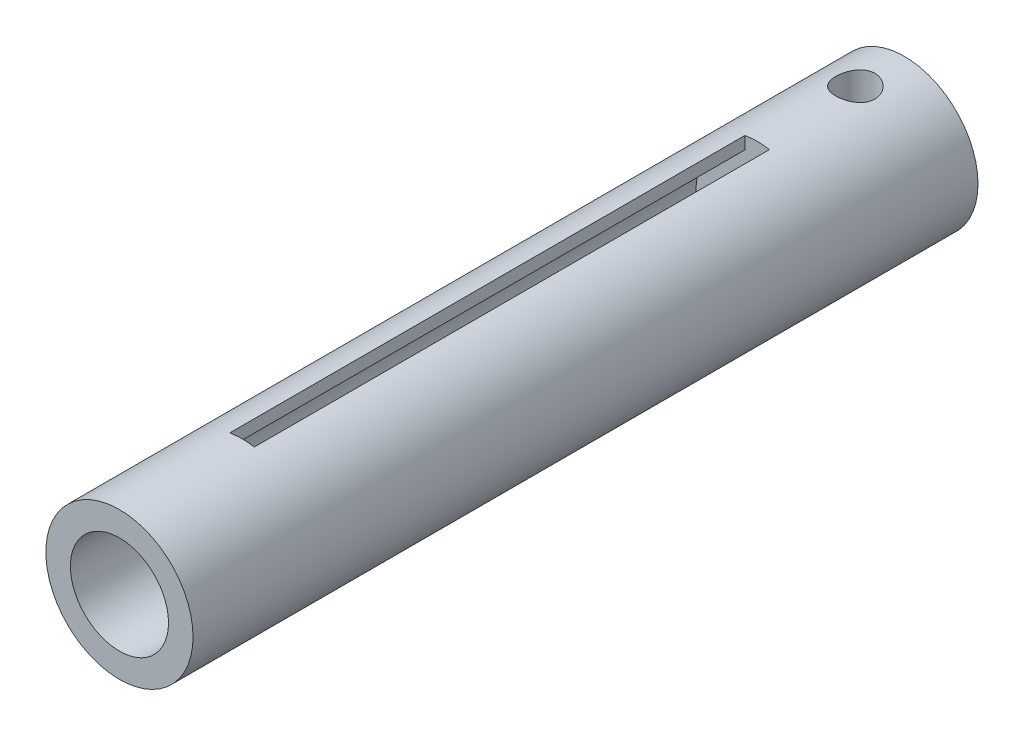
ISO-10303-21;
HEADER;
FILE_DESCRIPTION(('STEP AP214'),'2;1');
FILE_NAME('part.step','',(''),(''),'','','');
FILE_SCHEMA(('AUTOMOTIVE_DESIGN { 1 0 10303 214 1 1 1 1 }'));
ENDSEC;
DATA;
#1=APPLICATION_CONTEXT('core data for automotive mechanical design processes');
#2=APPLICATION_PROTOCOL_DEFINITION('international standard','automotive_design',2000,#1);
#3=PRODUCT_CONTEXT('',#1,'mechanical');
#4=PRODUCT('Part','Part','',(#3));
#5=PRODUCT_RELATED_PRODUCT_CATEGORY('part','',(#4));
#6=PRODUCT_DEFINITION_FORMATION('','',#4);
#7=PRODUCT_DEFINITION_CONTEXT('part definition',#1,'design');
#8=PRODUCT_DEFINITION('design','',#6,#7);
#9=PRODUCT_DEFINITION_SHAPE('','',#8);
#10=(LENGTH_UNIT() NAMED_UNIT(*) SI_UNIT(.MILLI.,.METRE.));
#11=(NAMED_UNIT(*) PLANE_ANGLE_UNIT() SI_UNIT($,.RADIAN.));
#12=(NAMED_UNIT(*) SI_UNIT($,.STERADIAN.) SOLID_ANGLE_UNIT());
#13=UNCERTAINTY_MEASURE_WITH_UNIT(LENGTH_MEASURE(1.E-05),#10,'distance_accuracy_value','');
#14=(GEOMETRIC_REPRESENTATION_CONTEXT(3) GLOBAL_UNCERTAINTY_ASSIGNED_CONTEXT((#13)) GLOBAL_UNIT_ASSIGNED_CONTEXT((#10,
#11,#12)) REPRESENTATION_CONTEXT('',''));
#15=CARTESIAN_POINT('',(0.,0.,0.));
#16=DIRECTION('',(0.,0.,1.));
#17=DIRECTION('',(1.,0.,0.));
#18=AXIS2_PLACEMENT_3D('',#15,#16,#17);
#19=CARTESIAN_POINT('',(0.,0.,20.));
#20=DIRECTION('',(0.,0.,1.));
#21=DIRECTION('',(1.,0.,0.));
#22=AXIS2_PLACEMENT_3D('',#19,#20,#21);
#23=CYLINDRICAL_SURFACE('',#22,12.5);
#24=DIRECTION('',(0.,0.,1.));
#25=VECTOR('',#24,1.);
#26=CARTESIAN_POINT('',(-2.5,12.2474487139159,20.));
#27=LINE('',#26,#25);
#28=CARTESIAN_POINT('',(-2.5,12.2474487139159,125.));
#29=VERTEX_POINT('',#28);
#30=CARTESIAN_POINT('',(-2.5,12.2474487139159,20.));
#31=VERTEX_POINT('',#30);
#32=EDGE_CURVE('E84',#29,#31,#27,.F.);
#33=ORIENTED_EDGE('',*,*,#32,.F.);
#34=CARTESIAN_POINT('',(0.,0.,125.));
#35=DIRECTION('',(0.,0.,1.));
#36=DIRECTION('',(1.,0.,0.));
#37=AXIS2_PLACEMENT_3D('',#34,#35,#36);
#38=CIRCLE('',#37,12.5);
#39=CARTESIAN_POINT('',(2.50000000000002,12.2474487139159,125.));
#40=VERTEX_POINT('',#39);
#41=EDGE_CURVE('E139',#29,#40,#38,.T.);
#42=ORIENTED_EDGE('',*,*,#41,.T.);
#43=DIRECTION('',(0.,0.,1.));
#44=VECTOR('',#43,1.);
#45=CARTESIAN_POINT('',(2.5,12.2474487139159,20.));
#46=LINE('',#45,#44);
#47=CARTESIAN_POINT('',(2.5,12.2474487139159,20.));
#48=VERTEX_POINT('',#47);
#49=EDGE_CURVE('E150',#40,#48,#46,.F.);
#50=ORIENTED_EDGE('',*,*,#49,.T.);
#51=CARTESIAN_POINT('',(0.,0.,20.));
#52=DIRECTION('',(0.,0.,1.));
#53=DIRECTION('',(1.,0.,0.));
#54=AXIS2_PLACEMENT_3D('',#51,#52,#53);
#55=CIRCLE('',#54,12.5);
#56=EDGE_CURVE('E136',#31,#48,#55,.T.);
#57=ORIENTED_EDGE('',*,*,#56,.F.);
#58=EDGE_LOOP('',(#33,#42,#50,#57));
#59=FACE_BOUND('',#58,.T.);
#60=ADVANCED_FACE('F33',(#59),#23,.F.);
#61=CARTESIAN_POINT('',(0.,0.,-10.));
#62=DIRECTION('',(0.,0.,1.));
#63=DIRECTION('',(1.,0.,0.));
#64=AXIS2_PLACEMENT_3D('',#61,#62,#63);
#65=CYLINDRICAL_SURFACE('',#64,15.);
#66=CARTESIAN_POINT('',(0.,-15.,4.));
#67=CARTESIAN_POINT('',(-0.220509111665708,-14.9999966762032,3.9999947661303));
#68=CARTESIAN_POINT('',(-0.441074320443681,-14.995089723243,3.98170477162066));
#69=CARTESIAN_POINT('',(-0.875850902708927,-14.9759914724332,3.90915753852261));
#70=CARTESIAN_POINT('',(-1.09005916663817,-14.9617957066517,3.85488299114777));
#71=CARTESIAN_POINT('',(-1.50578317809062,-14.9256866650558,3.71225666627193));
#72=CARTESIAN_POINT('',(-1.70731490203057,-14.9037833426075,3.62394882466796));
#73=CARTESIAN_POINT('',(-2.09270737278532,-14.8545739830336,3.41592551466677));
#74=CARTESIAN_POINT('',(-2.27656694089925,-14.8272675859036,3.29620795328142));
#75=CARTESIAN_POINT('',(-2.62565900748003,-14.7694922980399,3.02583296717326));
#76=CARTESIAN_POINT('',(-2.79042337972557,-14.7389693535736,2.87458266398347));
#77=CARTESIAN_POINT('',(-3.09257427321275,-14.6785481935918,2.54670303387329));
#78=CARTESIAN_POINT('',(-3.22995726991329,-14.6486500589449,2.37007044476495));
#79=CARTESIAN_POINT('',(-3.4757281848683,-14.5923107492874,1.9927035303491));
#80=CARTESIAN_POINT('',(-3.58357755472975,-14.5659377712648,1.79160734347655));
#81=CARTESIAN_POINT('',(-3.76375096153988,-14.5204295463637,1.37331977781515));
#82=CARTESIAN_POINT('',(-3.83608154902738,-14.5012929650653,1.15613137533712));
#83=CARTESIAN_POINT('',(-3.94153840453008,-14.472982316048,0.717008924349973));
#84=CARTESIAN_POINT('',(-3.97551340489383,-14.4635929562298,0.495292920138529));
#85=CARTESIAN_POINT('',(-4.00594069411639,-14.4551966183274,0.0491246333869234));
#86=CARTESIAN_POINT('',(-4.00239999411507,-14.4561877002889,-0.175327130048134));
#87=CARTESIAN_POINT('',(-3.95857020005398,-14.4682475760406,-0.613970830748121));
#88=CARTESIAN_POINT('',(-3.91930812129529,-14.4790347102306,-0.828274364076972));
#89=CARTESIAN_POINT('',(-3.80679497444366,-14.5090202616138,-1.24713666891248));
#90=CARTESIAN_POINT('',(-3.7335411898599,-14.5282193510522,-1.45169466015069));
#91=CARTESIAN_POINT('',(-3.55428713930512,-14.5731132349677,-1.84793628761715));
#92=CARTESIAN_POINT('',(-3.44792682275569,-14.5988788563741,-2.03944867857251));
#93=CARTESIAN_POINT('',(-3.20573007647555,-14.6539645928489,-2.40226831770305));
#94=CARTESIAN_POINT('',(-3.06988784448503,-14.6832854071037,-2.57357157831294));
#95=CARTESIAN_POINT('',(-2.76733214526838,-14.7433502125973,-2.8969779949096));
#96=CARTESIAN_POINT('',(-2.59975625456598,-14.7741094297766,-3.0482726366299));
#97=CARTESIAN_POINT('',(-2.24123533641274,-14.8327276255263,-3.32077756070057));
#98=CARTESIAN_POINT('',(-2.05028938841018,-14.8605864897711,-3.44198665740485));
#99=CARTESIAN_POINT('',(-1.6491965109949,-14.9104364079659,-3.6512358056493));
#100=CARTESIAN_POINT('',(-1.43896980510358,-14.9324014566712,-3.73912954089718));
#101=CARTESIAN_POINT('',(-1.00600458878079,-14.96780088802,-3.87809437762674));
#102=CARTESIAN_POINT('',(-0.783268823856646,-14.981237134675,-3.92917352544791));
#103=CARTESIAN_POINT('',(-0.338508166291031,-14.9977831711677,-3.99178975383565));
#104=CARTESIAN_POINT('',(-0.116648475282761,-15.0011799494192,-4.00442607970173));
#105=CARTESIAN_POINT('',(0.326020091802397,-14.9980894338339,-3.99283367150611));
#106=CARTESIAN_POINT('',(0.546829074124227,-14.9916031616071,-3.96860874778846));
#107=CARTESIAN_POINT('',(0.977204899803558,-14.9696607099204,-3.88488310508005));
#108=CARTESIAN_POINT('',(1.18689970405556,-14.9543605309265,-3.82599550760447));
#109=CARTESIAN_POINT('',(1.59341394235213,-14.9165258978828,-3.6753281109841));
#110=CARTESIAN_POINT('',(1.79023197843205,-14.8939906599234,-3.58354474749891));
#111=CARTESIAN_POINT('',(2.1696769493359,-14.8435132111904,-3.36765222563892));
#112=CARTESIAN_POINT('',(2.35195037692236,-14.8154737320985,-3.2429450664045));
#113=CARTESIAN_POINT('',(2.69336927079429,-14.7572290473119,-2.96549673968402));
#114=CARTESIAN_POINT('',(2.85251015759837,-14.7270234145527,-2.81275003479793));
#115=CARTESIAN_POINT('',(3.14777848957546,-14.6667949173317,-2.47842884501084));
#116=CARTESIAN_POINT('',(3.28313038499627,-14.6368012285772,-2.29616287720948));
#117=CARTESIAN_POINT('',(3.52134382370242,-14.5813289436636,-1.91087060780093));
#118=CARTESIAN_POINT('',(3.62420672244342,-14.5558501591602,-1.70784517275605));
#119=CARTESIAN_POINT('',(3.79374823172204,-14.5125853674305,-1.28780938584714));
#120=CARTESIAN_POINT('',(3.8606362450784,-14.4947549662348,-1.07088837636242));
#121=CARTESIAN_POINT('',(3.95682410237657,-14.4687965026614,-0.62832136065292));
#122=CARTESIAN_POINT('',(3.98613355205236,-14.4606659608681,-0.402677599313207));
#123=CARTESIAN_POINT('',(4.00577979307212,-14.4552348910192,0.0429895757885995));
#124=CARTESIAN_POINT('',(3.99736311235129,-14.4575879532022,0.262954640573328));
#125=CARTESIAN_POINT('',(3.94468751999858,-14.4720479199639,0.698207028070503));
#126=CARTESIAN_POINT('',(3.9004295306998,-14.4841545735456,0.913494471009552));
#127=CARTESIAN_POINT('',(3.77805031399794,-14.5165514219021,1.33171150424024));
#128=CARTESIAN_POINT('',(3.70019322151266,-14.5367777005106,1.53472368545915));
#129=CARTESIAN_POINT('',(3.51303109124666,-14.5831363626058,1.9249576610735));
#130=CARTESIAN_POINT('',(3.40372112049204,-14.6092696723953,2.11217697260241));
#131=CARTESIAN_POINT('',(3.15297818537663,-14.6654584288421,2.47146071899177));
#132=CARTESIAN_POINT('',(3.01069459535826,-14.6956066620426,2.64291706995204));
#133=CARTESIAN_POINT('',(2.69966107022192,-14.7559100756513,2.95992490333505));
#134=CARTESIAN_POINT('',(2.53090470871747,-14.7860652559664,3.10547007733779));
#135=CARTESIAN_POINT('',(2.16735996217739,-14.8437562480818,3.36958447529361));
#136=CARTESIAN_POINT('',(1.97209192350356,-14.8712222262917,3.48751002129863));
#137=CARTESIAN_POINT('',(1.56377728083377,-14.9196762020573,3.68867483185876));
#138=CARTESIAN_POINT('',(1.35074218939259,-14.9406683536717,3.77193635132721));
#139=CARTESIAN_POINT('',(0.948749409761982,-14.9710950502695,3.89055057083103));
#140=CARTESIAN_POINT('',(0.761524033130072,-14.9818554118521,3.93149876718499));
#141=CARTESIAN_POINT('',(0.382879590634153,-14.9963089807291,3.98622441233412));
#142=CARTESIAN_POINT('',(0.191460940809721,-15.0000028859454,4.00000454440005));
#143=CARTESIAN_POINT('',(0.,-15.,4.));
#144=B_SPLINE_CURVE_WITH_KNOTS('',3,(#66,#67,#68,#69,#70,#71,#72,#73,#74,#75,#76,#77,#78,#79,
#80,#81,#82,#83,#84,#85,#86,#87,#88,#89,#90,#91,#92,#93,#94,#95,#96,#97,#98,#99,#100,#101,#102,
#103,#104,#105,#106,#107,#108,#109,#110,#111,#112,#113,#114,#115,#116,#117,#118,#119,#120,#121,
#122,#123,#124,#125,#126,#127,#128,#129,#130,#131,#132,#133,#134,#135,#136,#137,#138,#139,#140,
#141,#142,#143),.UNSPECIFIED.,.T.,.F.,(4,2,2,2,2,2,2,2,2,2,2,2,2,2,2,2,2,2,2,2,2,2,2,2,2,2,2,2,
2,2,2,2,2,2,2,2,2,2,4),(0.,0.660825197899138,1.3219684875229,1.98226110594386,2.6425977341735,
3.31669795909934,3.99088489850298,4.67665165046458,5.36229188259399,6.03244316500936,
6.70246920808639,7.35382004091993,8.00522293625879,8.66397346692995,9.32285376235259,
10.0032251962464,10.6836234387519,11.3669761920608,12.0501795438028,12.7136543504909,
13.377060578507,14.0290707128423,14.6811515155123,15.346005720091,16.0109913651777,
16.6947299276558,17.3784399604821,18.0581259539877,18.7376381732796,19.394866848109,
20.0520786104837,20.7042153090379,21.3564543425319,22.0278867914997,22.6994824867208,
23.3854450456898,24.0709665229755,24.6447963799386,25.2185695593995),.UNSPECIFIED.);
#145=CARTESIAN_POINT('',(0.,-15.,4.));
#146=VERTEX_POINT('',#145);
#147=EDGE_CURVE('E81',#146,#146,#144,.T.);
#148=ORIENTED_EDGE('',*,*,#147,.F.);
#149=EDGE_LOOP('',(#148));
#150=FACE_BOUND('',#149,.T.);
#151=CARTESIAN_POINT('',(0.,15.,4.));
#152=CARTESIAN_POINT('',(0.220509111665708,14.9999966762032,3.9999947661303));
#153=CARTESIAN_POINT('',(0.441074320443681,14.995089723243,3.98170477162066));
#154=CARTESIAN_POINT('',(0.875850902708927,14.9759914724332,3.90915753852261));
#155=CARTESIAN_POINT('',(1.09005916663817,14.9617957066517,3.85488299114777));
#156=CARTESIAN_POINT('',(1.50578317809062,14.9256866650558,3.71225666627193));
#157=CARTESIAN_POINT('',(1.70731490203057,14.9037833426075,3.62394882466796));
#158=CARTESIAN_POINT('',(2.09270737278532,14.8545739830336,3.41592551466677));
#159=CARTESIAN_POINT('',(2.27656694089925,14.8272675859036,3.29620795328142));
#160=CARTESIAN_POINT('',(2.62565900748003,14.7694922980399,3.02583296717326));
#161=CARTESIAN_POINT('',(2.79042337972557,14.7389693535736,2.87458266398347));
#162=CARTESIAN_POINT('',(3.09257427321275,14.6785481935918,2.54670303387329));
#163=CARTESIAN_POINT('',(3.22995726991329,14.6486500589449,2.37007044476495));
#164=CARTESIAN_POINT('',(3.4757281848683,14.5923107492874,1.9927035303491));
#165=CARTESIAN_POINT('',(3.58357755472975,14.5659377712648,1.79160734347655));
#166=CARTESIAN_POINT('',(3.76375096153988,14.5204295463637,1.37331977781515));
#167=CARTESIAN_POINT('',(3.83608154902738,14.5012929650653,1.15613137533712));
#168=CARTESIAN_POINT('',(3.94153840453008,14.472982316048,0.717008924349973));
#169=CARTESIAN_POINT('',(3.97551340489383,14.4635929562298,0.495292920138529));
#170=CARTESIAN_POINT('',(4.00594069411639,14.4551966183274,0.0491246333869234));
#171=CARTESIAN_POINT('',(4.00239999411507,14.4561877002889,-0.175327130048134));
#172=CARTESIAN_POINT('',(3.95857020005398,14.4682475760406,-0.613970830748121));
#173=CARTESIAN_POINT('',(3.91930812129529,14.4790347102306,-0.828274364076972));
#174=CARTESIAN_POINT('',(3.80679497444366,14.5090202616138,-1.24713666891248));
#175=CARTESIAN_POINT('',(3.7335411898599,14.5282193510522,-1.45169466015069));
#176=CARTESIAN_POINT('',(3.55428713930512,14.5731132349677,-1.84793628761715));
#177=CARTESIAN_POINT('',(3.44792682275569,14.5988788563741,-2.03944867857251));
#178=CARTESIAN_POINT('',(3.20573007647555,14.6539645928489,-2.40226831770305));
#179=CARTESIAN_POINT('',(3.06988784448503,14.6832854071037,-2.57357157831294));
#180=CARTESIAN_POINT('',(2.76733214526838,14.7433502125973,-2.8969779949096));
#181=CARTESIAN_POINT('',(2.59975625456598,14.7741094297766,-3.0482726366299));
#182=CARTESIAN_POINT('',(2.24123533641274,14.8327276255263,-3.32077756070057));
#183=CARTESIAN_POINT('',(2.05028938841018,14.8605864897711,-3.44198665740485));
#184=CARTESIAN_POINT('',(1.6491965109949,14.9104364079659,-3.6512358056493));
#185=CARTESIAN_POINT('',(1.43896980510358,14.9324014566712,-3.73912954089718));
#186=CARTESIAN_POINT('',(1.00600458878079,14.96780088802,-3.87809437762674));
#187=CARTESIAN_POINT('',(0.783268823856646,14.981237134675,-3.92917352544791));
#188=CARTESIAN_POINT('',(0.338508166291031,14.9977831711677,-3.99178975383565));
#189=CARTESIAN_POINT('',(0.116648475282761,15.0011799494192,-4.00442607970173));
#190=CARTESIAN_POINT('',(-0.326020091802397,14.9980894338339,-3.99283367150611));
#191=CARTESIAN_POINT('',(-0.546829074124227,14.9916031616071,-3.96860874778846));
#192=CARTESIAN_POINT('',(-0.977204899803558,14.9696607099204,-3.88488310508005));
#193=CARTESIAN_POINT('',(-1.18689970405556,14.9543605309265,-3.82599550760447));
#194=CARTESIAN_POINT('',(-1.59341394235213,14.9165258978828,-3.6753281109841));
#195=CARTESIAN_POINT('',(-1.79023197843205,14.8939906599234,-3.58354474749891));
#196=CARTESIAN_POINT('',(-2.1696769493359,14.8435132111904,-3.36765222563892));
#197=CARTESIAN_POINT('',(-2.35195037692236,14.8154737320985,-3.2429450664045));
#198=CARTESIAN_POINT('',(-2.69336927079429,14.7572290473119,-2.96549673968402));
#199=CARTESIAN_POINT('',(-2.85251015759837,14.7270234145527,-2.81275003479793));
#200=CARTESIAN_POINT('',(-3.14777848957546,14.6667949173317,-2.47842884501084));
#201=CARTESIAN_POINT('',(-3.28313038499627,14.6368012285772,-2.29616287720948));
#202=CARTESIAN_POINT('',(-3.52134382370242,14.5813289436636,-1.91087060780093));
#203=CARTESIAN_POINT('',(-3.62420672244342,14.5558501591602,-1.70784517275605));
#204=CARTESIAN_POINT('',(-3.79374823172204,14.5125853674305,-1.28780938584714));
#205=CARTESIAN_POINT('',(-3.8606362450784,14.4947549662348,-1.07088837636242));
#206=CARTESIAN_POINT('',(-3.95682410237657,14.4687965026614,-0.62832136065292));
#207=CARTESIAN_POINT('',(-3.98613355205236,14.4606659608681,-0.402677599313207));
#208=CARTESIAN_POINT('',(-4.00577979307212,14.4552348910192,0.0429895757885995));
#209=CARTESIAN_POINT('',(-3.99736311235129,14.4575879532022,0.262954640573328));
#210=CARTESIAN_POINT('',(-3.94468751999858,14.4720479199639,0.698207028070503));
#211=CARTESIAN_POINT('',(-3.9004295306998,14.4841545735456,0.913494471009552));
#212=CARTESIAN_POINT('',(-3.77805031399794,14.5165514219021,1.33171150424024));
#213=CARTESIAN_POINT('',(-3.70019322151266,14.5367777005106,1.53472368545915));
#214=CARTESIAN_POINT('',(-3.51303109124666,14.5831363626058,1.9249576610735));
#215=CARTESIAN_POINT('',(-3.40372112049204,14.6092696723953,2.11217697260241));
#216=CARTESIAN_POINT('',(-3.15297818537663,14.6654584288421,2.47146071899177));
#217=CARTESIAN_POINT('',(-3.01069459535826,14.6956066620426,2.64291706995204));
#218=CARTESIAN_POINT('',(-2.69966107022192,14.7559100756513,2.95992490333505));
#219=CARTESIAN_POINT('',(-2.53090470871747,14.7860652559664,3.10547007733779));
#220=CARTESIAN_POINT('',(-2.16735996217739,14.8437562480818,3.36958447529361));
#221=CARTESIAN_POINT('',(-1.97209192350356,14.8712222262917,3.48751002129863));
#222=CARTESIAN_POINT('',(-1.56377728083377,14.9196762020573,3.68867483185876));
#223=CARTESIAN_POINT('',(-1.35074218939259,14.9406683536717,3.77193635132721));
#224=CARTESIAN_POINT('',(-0.948749409761982,14.9710950502695,3.89055057083103));
#225=CARTESIAN_POINT('',(-0.761524033130072,14.9818554118521,3.93149876718499));
#226=CARTESIAN_POINT('',(-0.382879590634153,14.9963089807291,3.98622441233412));
#227=CARTESIAN_POINT('',(-0.191460940809721,15.0000028859454,4.00000454440005));
#228=CARTESIAN_POINT('',(0.,15.,4.));
#229=B_SPLINE_CURVE_WITH_KNOTS('',3,(#151,#152,#153,#154,#155,#156,#157,#158,#159,#160,#161,
#162,#163,#164,#165,#166,#167,#168,#169,#170,#171,#172,#173,#174,#175,#176,#177,#178,#179,#180,
#181,#182,#183,#184,#185,#186,#187,#188,#189,#190,#191,#192,#193,#194,#195,#196,#197,#198,#199,
#200,#201,#202,#203,#204,#205,#206,#207,#208,#209,#210,#211,#212,#213,#214,#215,#216,#217,#218,
#219,#220,#221,#222,#223,#224,#225,#226,#227,#228),.UNSPECIFIED.,.T.,.F.,(4,2,2,2,2,2,2,2,2,2,2,
2,2,2,2,2,2,2,2,2,2,2,2,2,2,2,2,2,2,2,2,2,2,2,2,2,2,2,4),(0.,0.660825197899138,1.3219684875229,
1.98226110594386,2.6425977341735,3.31669795909934,3.99088489850298,4.67665165046458,
5.36229188259399,6.03244316500936,6.70246920808639,7.35382004091993,8.00522293625879,
8.66397346692995,9.32285376235259,10.0032251962464,10.6836234387519,11.3669761920608,
12.0501795438028,12.7136543504909,13.377060578507,14.0290707128423,14.6811515155123,
15.346005720091,16.0109913651777,16.6947299276558,17.3784399604821,18.0581259539877,
18.7376381732796,19.394866848109,20.0520786104837,20.7042153090379,21.3564543425319,
22.0278867914997,22.6994824867208,23.3854450456898,24.0709665229755,24.6447963799386,
25.2185695593995),.UNSPECIFIED.);
#230=CARTESIAN_POINT('',(0.,15.,4.));
#231=VERTEX_POINT('',#230);
#232=EDGE_CURVE('E95',#231,#231,#229,.T.);
#233=ORIENTED_EDGE('',*,*,#232,.F.);
#234=EDGE_LOOP('',(#233));
#235=FACE_BOUND('',#234,.T.);
#236=CARTESIAN_POINT('',(0.,0.,-10.));
#237=DIRECTION('',(0.,0.,1.));
#238=DIRECTION('',(1.,0.,0.));
#239=AXIS2_PLACEMENT_3D('',#236,#237,#238);
#240=CIRCLE('',#239,15.);
#241=CARTESIAN_POINT('',(15.,0.,-10.));
#242=VERTEX_POINT('',#241);
#243=EDGE_CURVE('E131',#242,#242,#240,.T.);
#244=ORIENTED_EDGE('',*,*,#243,.T.);
#245=EDGE_LOOP('',(#244));
#246=FACE_BOUND('',#245,.T.);
#247=CARTESIAN_POINT('',(0.,0.,150.));
#248=DIRECTION('',(0.,0.,1.));
#249=DIRECTION('',(1.,0.,0.));
#250=AXIS2_PLACEMENT_3D('',#247,#248,#249);
#251=CIRCLE('',#250,15.);
#252=CARTESIAN_POINT('',(15.,0.,150.));
#253=VERTEX_POINT('',#252);
#254=EDGE_CURVE('E133',#253,#253,#251,.T.);
#255=ORIENTED_EDGE('',*,*,#254,.F.);
#256=EDGE_LOOP('',(#255));
#257=FACE_BOUND('',#256,.T.);
#258=DIRECTION('',(0.,0.,1.));
#259=VECTOR('',#258,1.);
#260=CARTESIAN_POINT('',(2.5,14.790199457749,-10.));
#261=LINE('',#260,#259);
#262=CARTESIAN_POINT('',(2.50000000000002,14.790199457749,125.));
#263=VERTEX_POINT('',#262);
#264=CARTESIAN_POINT('',(2.5,14.790199457749,20.));
#265=VERTEX_POINT('',#264);
#266=EDGE_CURVE('E11',#263,#265,#261,.F.);
#267=ORIENTED_EDGE('',*,*,#266,.F.);
#268=CARTESIAN_POINT('',(0.,0.,125.));
#269=DIRECTION('',(0.,0.,-1.));
#270=DIRECTION('',(-1.,0.,0.));
#271=AXIS2_PLACEMENT_3D('',#268,#269,#270);
#272=CIRCLE('',#271,15.);
#273=CARTESIAN_POINT('',(-2.5,14.790199457749,125.));
#274=VERTEX_POINT('',#273);
#275=EDGE_CURVE('E80',#263,#274,#272,.F.);
#276=ORIENTED_EDGE('',*,*,#275,.T.);
#277=DIRECTION('',(0.,0.,1.));
#278=VECTOR('',#277,1.);
#279=CARTESIAN_POINT('',(-2.5,14.790199457749,-10.));
#280=LINE('',#279,#278);
#281=CARTESIAN_POINT('',(-2.5,14.790199457749,20.));
#282=VERTEX_POINT('',#281);
#283=EDGE_CURVE('E42',#274,#282,#280,.F.);
#284=ORIENTED_EDGE('',*,*,#283,.T.);
#285=CARTESIAN_POINT('',(0.,0.,20.));
#286=DIRECTION('',(0.,0.,-1.));
#287=DIRECTION('',(-1.,0.,0.));
#288=AXIS2_PLACEMENT_3D('',#285,#286,#287);
#289=CIRCLE('',#288,15.);
#290=EDGE_CURVE('E74',#265,#282,#289,.F.);
#291=ORIENTED_EDGE('',*,*,#290,.F.);
#292=EDGE_LOOP('',(#267,#276,#284,#291));
#293=FACE_BOUND('',#292,.T.);
#294=ADVANCED_FACE('F35',(#150,#235,#246,#257,#293),#65,.T.);
#295=CARTESIAN_POINT('',(0.,0.,20.));
#296=DIRECTION('',(0.,0.,1.));
#297=DIRECTION('',(1.,0.,0.));
#298=AXIS2_PLACEMENT_3D('',#295,#296,#297);
#299=PLANE('',#298);
#300=ORIENTED_EDGE('',*,*,#56,.T.);
#301=DIRECTION('',(0.,-1.,0.));
#302=VECTOR('',#301,1.);
#303=CARTESIAN_POINT('',(2.5,15.,20.));
#304=LINE('',#303,#302);
#305=EDGE_CURVE('E76',#265,#48,#304,.T.);
#306=ORIENTED_EDGE('',*,*,#305,.F.);
#307=ORIENTED_EDGE('',*,*,#290,.T.);
#308=DIRECTION('',(0.,-1.,0.));
#309=VECTOR('',#308,1.);
#310=CARTESIAN_POINT('',(-2.5,15.,20.));
#311=LINE('',#310,#309);
#312=EDGE_CURVE('E49',#282,#31,#311,.T.);
#313=ORIENTED_EDGE('',*,*,#312,.T.);
#314=EDGE_LOOP('',(#300,#306,#307,#313));
#315=FACE_BOUND('',#314,.T.);
#316=ADVANCED_FACE('F75',(#315),#299,.T.);
#317=CARTESIAN_POINT('',(0.,0.,125.));
#318=DIRECTION('',(0.,0.,1.));
#319=DIRECTION('',(1.,0.,0.));
#320=AXIS2_PLACEMENT_3D('',#317,#318,#319);
#321=PLANE('',#320);
#322=ORIENTED_EDGE('',*,*,#41,.F.);
#323=DIRECTION('',(0.,-1.,0.));
#324=VECTOR('',#323,1.);
#325=CARTESIAN_POINT('',(-2.5,15.,125.));
#326=LINE('',#325,#324);
#327=EDGE_CURVE('E56',#274,#29,#326,.T.);
#328=ORIENTED_EDGE('',*,*,#327,.F.);
#329=ORIENTED_EDGE('',*,*,#275,.F.);
#330=DIRECTION('',(0.,-1.,0.));
#331=VECTOR('',#330,1.);
#332=CARTESIAN_POINT('',(2.50000000000002,15.,125.));
#333=LINE('',#332,#331);
#334=EDGE_CURVE('E154',#263,#40,#333,.T.);
#335=ORIENTED_EDGE('',*,*,#334,.T.);
#336=EDGE_LOOP('',(#322,#328,#329,#335));
#337=FACE_BOUND('',#336,.T.);
#338=CARTESIAN_POINT('',(0.,0.,125.));
#339=DIRECTION('',(0.,0.,1.));
#340=DIRECTION('',(1.,0.,0.));
#341=AXIS2_PLACEMENT_3D('',#338,#339,#340);
#342=CIRCLE('',#341,10.);
#343=CARTESIAN_POINT('',(10.,0.,125.));
#344=VERTEX_POINT('',#343);
#345=EDGE_CURVE('E142',#344,#344,#342,.F.);
#346=ORIENTED_EDGE('',*,*,#345,.F.);
#347=EDGE_LOOP('',(#346));
#348=FACE_BOUND('',#347,.T.);
#349=ADVANCED_FACE('F112',(#337,#348),#321,.F.);
#350=CARTESIAN_POINT('',(0.,0.,-10.001));
#351=DIRECTION('',(0.,0.,1.));
#352=DIRECTION('',(1.,0.,0.));
#353=AXIS2_PLACEMENT_3D('',#350,#351,#352);
#354=CYLINDRICAL_SURFACE('',#353,10.);
#355=CARTESIAN_POINT('',(0.,0.,150.));
#356=DIRECTION('',(0.,0.,1.));
#357=DIRECTION('',(1.,0.,0.));
#358=AXIS2_PLACEMENT_3D('',#355,#356,#357);
#359=CIRCLE('',#358,10.);
#360=CARTESIAN_POINT('',(10.,0.,150.));
#361=VERTEX_POINT('',#360);
#362=EDGE_CURVE('E146',#361,#361,#359,.T.);
#363=ORIENTED_EDGE('',*,*,#362,.T.);
#364=EDGE_LOOP('',(#363));
#365=FACE_BOUND('',#364,.T.);
#366=ORIENTED_EDGE('',*,*,#345,.T.);
#367=EDGE_LOOP('',(#366));
#368=FACE_BOUND('',#367,.T.);
#369=ADVANCED_FACE('F107',(#365,#368),#354,.F.);
#370=CARTESIAN_POINT('',(0.,0.,-10.));
#371=DIRECTION('',(0.,0.,1.));
#372=DIRECTION('',(1.,0.,0.));
#373=AXIS2_PLACEMENT_3D('',#370,#371,#372);
#374=PLANE('',#373);
#375=ORIENTED_EDGE('',*,*,#243,.F.);
#376=EDGE_LOOP('',(#375));
#377=FACE_BOUND('',#376,.T.);
#378=ADVANCED_FACE('F111',(#377),#374,.F.);
#379=CARTESIAN_POINT('',(0.,0.,150.));
#380=DIRECTION('',(0.,0.,1.));
#381=DIRECTION('',(1.,0.,0.));
#382=AXIS2_PLACEMENT_3D('',#379,#380,#381);
#383=PLANE('',#382);
#384=ORIENTED_EDGE('',*,*,#362,.F.);
#385=EDGE_LOOP('',(#384));
#386=FACE_BOUND('',#385,.T.);
#387=ORIENTED_EDGE('',*,*,#254,.T.);
#388=EDGE_LOOP('',(#387));
#389=FACE_BOUND('',#388,.T.);
#390=ADVANCED_FACE('F104',(#386,#389),#383,.T.);
#391=CARTESIAN_POINT('',(0.,-15.,0.));
#392=DIRECTION('',(0.,1.,0.));
#393=DIRECTION('',(0.,0.,1.));
#394=AXIS2_PLACEMENT_3D('',#391,#392,#393);
#395=CYLINDRICAL_SURFACE('',#394,4.);
#396=ORIENTED_EDGE('',*,*,#147,.T.);
#397=EDGE_LOOP('',(#396));
#398=FACE_BOUND('',#397,.T.);
#399=ORIENTED_EDGE('',*,*,#232,.T.);
#400=EDGE_LOOP('',(#399));
#401=FACE_BOUND('',#400,.T.);
#402=ADVANCED_FACE('F99',(#398,#401),#395,.F.);
#403=CARTESIAN_POINT('',(-2.5,15.,20.));
#404=DIRECTION('',(1.,0.,0.));
#405=DIRECTION('',(0.,0.,-1.));
#406=AXIS2_PLACEMENT_3D('',#403,#404,#405);
#407=PLANE('',#406);
#408=ORIENTED_EDGE('',*,*,#32,.T.);
#409=ORIENTED_EDGE('',*,*,#312,.F.);
#410=ORIENTED_EDGE('',*,*,#283,.F.);
#411=ORIENTED_EDGE('',*,*,#327,.T.);
#412=EDGE_LOOP('',(#408,#409,#410,#411));
#413=FACE_BOUND('',#412,.T.);
#414=ADVANCED_FACE('F83',(#413),#407,.T.);
#415=CARTESIAN_POINT('',(2.5,15.,20.));
#416=DIRECTION('',(1.,0.,0.));
#417=DIRECTION('',(0.,0.,-1.));
#418=AXIS2_PLACEMENT_3D('',#415,#416,#417);
#419=PLANE('',#418);
#420=ORIENTED_EDGE('',*,*,#334,.F.);
#421=ORIENTED_EDGE('',*,*,#266,.T.);
#422=ORIENTED_EDGE('',*,*,#305,.T.);
#423=ORIENTED_EDGE('',*,*,#49,.F.);
#424=EDGE_LOOP('',(#420,#421,#422,#423));
#425=FACE_BOUND('',#424,.T.);
#426=ADVANCED_FACE('F159',(#425),#419,.F.);
#427=CLOSED_SHELL('',(#60,#294,#316,#349,#369,#378,#390,#402,#414,#426));
#428=MANIFOLD_SOLID_BREP('B2',#427);
#429=ADVANCED_BREP_SHAPE_REPRESENTATION('',(#18,#428),#14);
#430=SHAPE_DEFINITION_REPRESENTATION(#9,#429);
ENDSEC;
END-ISO-10303-21;
